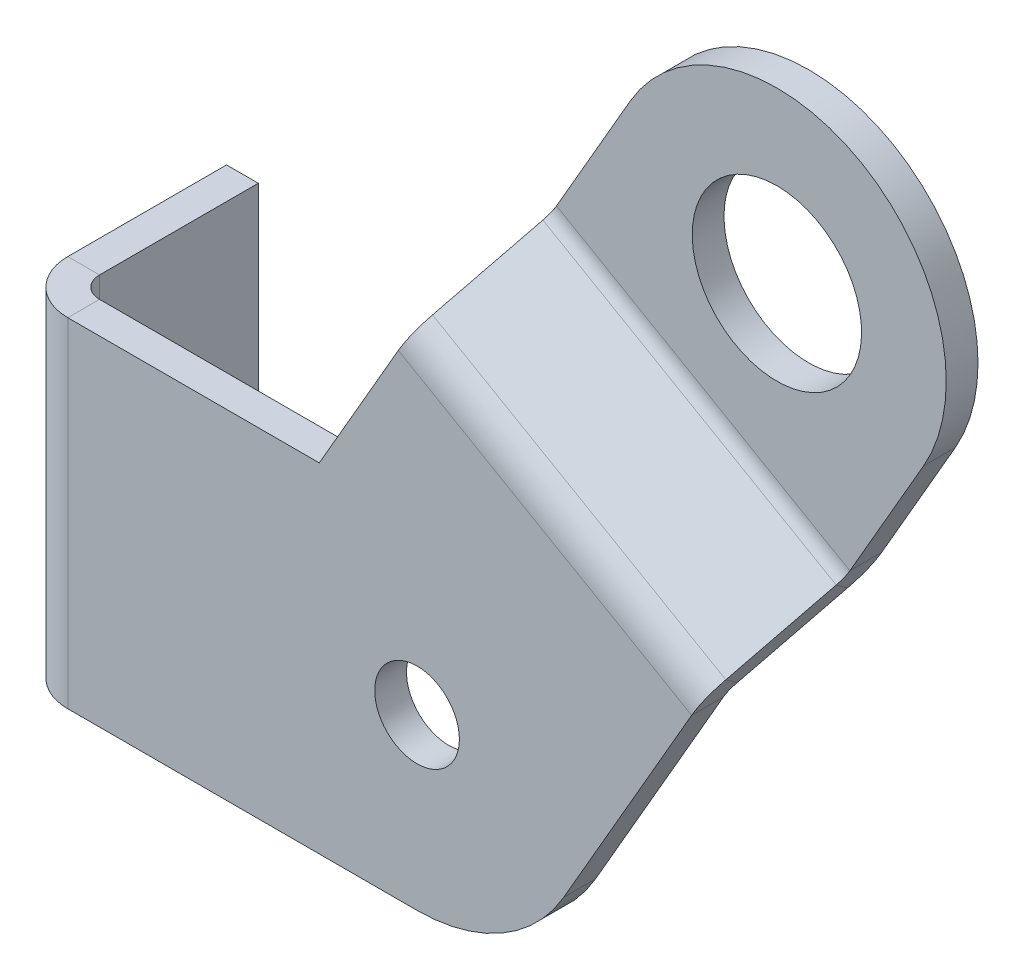
ISO-10303-21;
HEADER;
FILE_DESCRIPTION(('STEP AP214'),'2;1');
FILE_NAME('part.step','',(''),(''),'','','');
FILE_SCHEMA(('AUTOMOTIVE_DESIGN { 1 0 10303 214 1 1 1 1 }'));
ENDSEC;
DATA;
#1=APPLICATION_CONTEXT('core data for automotive mechanical design processes');
#2=APPLICATION_PROTOCOL_DEFINITION('international standard','automotive_design',2000,#1);
#3=PRODUCT_CONTEXT('',#1,'mechanical');
#4=PRODUCT('Part','Part','',(#3));
#5=PRODUCT_RELATED_PRODUCT_CATEGORY('part','',(#4));
#6=PRODUCT_DEFINITION_FORMATION('','',#4);
#7=PRODUCT_DEFINITION_CONTEXT('part definition',#1,'design');
#8=PRODUCT_DEFINITION('design','',#6,#7);
#9=PRODUCT_DEFINITION_SHAPE('','',#8);
#10=(LENGTH_UNIT() NAMED_UNIT(*) SI_UNIT(.MILLI.,.METRE.));
#11=(NAMED_UNIT(*) PLANE_ANGLE_UNIT() SI_UNIT($,.RADIAN.));
#12=(NAMED_UNIT(*) SI_UNIT($,.STERADIAN.) SOLID_ANGLE_UNIT());
#13=UNCERTAINTY_MEASURE_WITH_UNIT(LENGTH_MEASURE(1.E-05),#10,'distance_accuracy_value','');
#14=(GEOMETRIC_REPRESENTATION_CONTEXT(3) GLOBAL_UNCERTAINTY_ASSIGNED_CONTEXT((#13)) GLOBAL_UNIT_ASSIGNED_CONTEXT((#10,
#11,#12)) REPRESENTATION_CONTEXT('',''));
#15=CARTESIAN_POINT('',(0.,0.,0.));
#16=DIRECTION('',(0.,0.,1.));
#17=DIRECTION('',(1.,0.,0.));
#18=AXIS2_PLACEMENT_3D('',#15,#16,#17);
#19=CARTESIAN_POINT('',(-0.735086116991229,30.7267934974324,3.));
#20=DIRECTION('',(0.866025403784436,-0.500000000000004,0.));
#21=DIRECTION('',(-0.353553390593277,-0.612372435695793,0.707106781186547));
#22=AXIS2_PLACEMENT_3D('',#19,#20,#21);
#23=PLANE('',#22);
#24=DIRECTION('',(0.353553390593277,0.612372435695792,0.707106781186548));
#25=VECTOR('',#24,1.);
#26=CARTESIAN_POINT('',(3.47202066419535,38.0137161953151,-5.41421356237309));
#27=LINE('',#26,#25);
#28=CARTESIAN_POINT('',(2.41136049241552,36.1765988882277,-7.53553390593274));
#29=VERTEX_POINT('',#28);
#30=CARTESIAN_POINT('',(3.47202066419535,38.0137161953151,-5.41421356237309));
#31=VERTEX_POINT('',#30);
#32=EDGE_CURVE('E13',#29,#31,#27,.T.);
#33=ORIENTED_EDGE('',*,*,#32,.F.);
#34=DIRECTION('',(-0.353553390593277,-0.612372435695793,0.707106781186547));
#35=VECTOR('',#34,1.);
#36=CARTESIAN_POINT('',(-1.79574628877106,28.889676190345,0.878679656440357));
#37=LINE('',#36,#35);
#38=CARTESIAN_POINT('',(-1.0635132417374,30.1579410307882,-0.585786437626908));
#39=VERTEX_POINT('',#38);
#40=EDGE_CURVE('E206',#29,#39,#37,.T.);
#41=ORIENTED_EDGE('',*,*,#40,.T.);
#42=DIRECTION('',(0.353553390593274,0.612372435695795,0.707106781186547));
#43=VECTOR('',#42,1.);
#44=CARTESIAN_POINT('',(-0.00285306995759065,31.9950583378756,1.53553390593274));
#45=LINE('',#44,#43);
#46=CARTESIAN_POINT('',(-0.00285306995759065,31.9950583378756,1.53553390593274));
#47=VERTEX_POINT('',#46);
#48=EDGE_CURVE('E144',#39,#47,#45,.T.);
#49=ORIENTED_EDGE('',*,*,#48,.T.);
#50=DIRECTION('',(-0.353553390593277,-0.612372435695793,0.707106781186547));
#51=VECTOR('',#50,1.);
#52=CARTESIAN_POINT('',(-0.735086116991229,30.7267934974324,3.));
#53=LINE('',#52,#51);
#54=EDGE_CURVE('E209',#31,#47,#53,.T.);
#55=ORIENTED_EDGE('',*,*,#54,.F.);
#56=EDGE_LOOP('',(#33,#41,#49,#55));
#57=FACE_BOUND('',#56,.T.);
#58=ADVANCED_FACE('F134',(#57),#23,.F.);
#59=CARTESIAN_POINT('',(-1.77062002292397,28.9331961593967,-2.));
#60=DIRECTION('',(0.866025403784437,-0.500000000000004,0.));
#61=DIRECTION('',(0.500000000000004,0.866025403784437,0.));
#62=AXIS2_PLACEMENT_3D('',#59,#60,#61);
#63=PLANE('',#62);
#64=ORIENTED_EDGE('',*,*,#48,.F.);
#65=CARTESIAN_POINT('',(-1.77062002292396,28.9331961593967,-2.));
#66=DIRECTION('',(-0.866025403784436,0.500000000000004,0.));
#67=DIRECTION('',(-0.500000000000004,-0.866025403784436,0.));
#68=AXIS2_PLACEMENT_3D('',#65,#66,#67);
#69=CIRCLE('',#68,2.);
#70=CARTESIAN_POINT('',(-1.77062002292396,28.9331961593967,0.));
#71=VERTEX_POINT('',#70);
#72=EDGE_CURVE('E354',#39,#71,#69,.F.);
#73=ORIENTED_EDGE('',*,*,#72,.T.);
#74=DIRECTION('',(0.,0.,1.));
#75=VECTOR('',#74,1.);
#76=CARTESIAN_POINT('',(-1.77062002292398,28.9331961593967,3.));
#77=LINE('',#76,#75);
#78=CARTESIAN_POINT('',(-1.77062002292398,28.9331961593967,3.));
#79=VERTEX_POINT('',#78);
#80=EDGE_CURVE('E287',#71,#79,#77,.T.);
#81=ORIENTED_EDGE('',*,*,#80,.T.);
#82=CARTESIAN_POINT('',(-1.77062002292397,28.9331961593967,-2.));
#83=DIRECTION('',(-0.866025403784437,0.500000000000004,0.));
#84=DIRECTION('',(-0.500000000000004,-0.866025403784437,0.));
#85=AXIS2_PLACEMENT_3D('',#82,#83,#84);
#86=CIRCLE('',#85,5.);
#87=EDGE_CURVE('E309',#47,#79,#86,.F.);
#88=ORIENTED_EDGE('',*,*,#87,.F.);
#89=EDGE_LOOP('',(#64,#73,#81,#88));
#90=FACE_BOUND('',#89,.T.);
#91=ADVANCED_FACE('F310',(#90),#63,.F.);
#92=CARTESIAN_POINT('',(-13.856406460551,8.00000000000006,3.));
#93=DIRECTION('',(-0.866025403784436,0.500000000000004,0.));
#94=DIRECTION('',(-0.500000000000004,-0.866025403784436,0.));
#95=AXIS2_PLACEMENT_3D('',#92,#93,#94);
#96=PLANE('',#95);
#97=ORIENTED_EDGE('',*,*,#80,.F.);
#98=DIRECTION('',(-0.500000000000004,-0.866025403784436,0.));
#99=VECTOR('',#98,1.);
#100=CARTESIAN_POINT('',(-13.856406460551,8.00000000000006,0.));
#101=LINE('',#100,#99);
#102=CARTESIAN_POINT('',(-9.23760430703396,16.,0.));
#103=VERTEX_POINT('',#102);
#104=EDGE_CURVE('E236',#71,#103,#101,.T.);
#105=ORIENTED_EDGE('',*,*,#104,.T.);
#106=DIRECTION('',(0.,0.,1.));
#107=VECTOR('',#106,1.);
#108=CARTESIAN_POINT('',(-9.23760430703396,16.,3.));
#109=LINE('',#108,#107);
#110=CARTESIAN_POINT('',(-9.23760430703396,16.,3.));
#111=VERTEX_POINT('',#110);
#112=EDGE_CURVE('E284',#103,#111,#109,.T.);
#113=ORIENTED_EDGE('',*,*,#112,.T.);
#114=DIRECTION('',(-0.500000000000004,-0.866025403784436,0.));
#115=VECTOR('',#114,1.);
#116=CARTESIAN_POINT('',(-13.856406460551,8.00000000000006,3.));
#117=LINE('',#116,#115);
#118=EDGE_CURVE('E305',#79,#111,#117,.T.);
#119=ORIENTED_EDGE('',*,*,#118,.F.);
#120=EDGE_LOOP('',(#97,#105,#113,#119));
#121=FACE_BOUND('',#120,.T.);
#122=ADVANCED_FACE('F382',(#121),#96,.T.);
#123=CARTESIAN_POINT('',(0.,16.,3.));
#124=DIRECTION('',(0.,-1.,0.));
#125=DIRECTION('',(1.,0.,0.));
#126=AXIS2_PLACEMENT_3D('',#123,#124,#125);
#127=PLANE('',#126);
#128=ORIENTED_EDGE('',*,*,#112,.F.);
#129=DIRECTION('',(1.,0.,0.));
#130=VECTOR('',#129,1.);
#131=CARTESIAN_POINT('',(0.,16.,0.));
#132=LINE('',#131,#130);
#133=CARTESIAN_POINT('',(-33.,16.,0.));
#134=VERTEX_POINT('',#133);
#135=EDGE_CURVE('E367',#134,#103,#132,.T.);
#136=ORIENTED_EDGE('',*,*,#135,.F.);
#137=DIRECTION('',(0.,0.,1.));
#138=VECTOR('',#137,1.);
#139=CARTESIAN_POINT('',(-33.,16.,3.));
#140=LINE('',#139,#138);
#141=CARTESIAN_POINT('',(-33.,16.,3.));
#142=VERTEX_POINT('',#141);
#143=EDGE_CURVE('E281',#134,#142,#140,.T.);
#144=ORIENTED_EDGE('',*,*,#143,.T.);
#145=DIRECTION('',(1.,0.,0.));
#146=VECTOR('',#145,1.);
#147=CARTESIAN_POINT('',(0.,16.,3.));
#148=LINE('',#147,#146);
#149=EDGE_CURVE('E389',#142,#111,#148,.T.);
#150=ORIENTED_EDGE('',*,*,#149,.T.);
#151=EDGE_LOOP('',(#128,#136,#144,#150));
#152=FACE_BOUND('',#151,.T.);
#153=ADVANCED_FACE('F830',(#152),#127,.F.);
#154=CARTESIAN_POINT('',(0.,-16.,3.));
#155=DIRECTION('',(0.,1.,0.));
#156=DIRECTION('',(-1.,0.,0.));
#157=AXIS2_PLACEMENT_3D('',#154,#155,#156);
#158=PLANE('',#157);
#159=DIRECTION('',(0.,0.,1.));
#160=VECTOR('',#159,1.);
#161=CARTESIAN_POINT('',(-33.,-16.,3.));
#162=LINE('',#161,#160);
#163=CARTESIAN_POINT('',(-33.,-16.,0.));
#164=VERTEX_POINT('',#163);
#165=CARTESIAN_POINT('',(-33.,-16.,3.));
#166=VERTEX_POINT('',#165);
#167=EDGE_CURVE('E278',#164,#166,#162,.T.);
#168=ORIENTED_EDGE('',*,*,#167,.F.);
#169=DIRECTION('',(1.,0.,0.));
#170=VECTOR('',#169,1.);
#171=CARTESIAN_POINT('',(0.,-16.,0.));
#172=LINE('',#171,#170);
#173=CARTESIAN_POINT('',(0.,-16.,0.));
#174=VERTEX_POINT('',#173);
#175=EDGE_CURVE('E362',#174,#164,#172,.F.);
#176=ORIENTED_EDGE('',*,*,#175,.F.);
#177=DIRECTION('',(0.,0.,1.));
#178=VECTOR('',#177,1.);
#179=CARTESIAN_POINT('',(0.,-16.,3.));
#180=LINE('',#179,#178);
#181=CARTESIAN_POINT('',(0.,-16.,3.));
#182=VERTEX_POINT('',#181);
#183=EDGE_CURVE('E275',#174,#182,#180,.T.);
#184=ORIENTED_EDGE('',*,*,#183,.T.);
#185=DIRECTION('',(-1.,0.,0.));
#186=VECTOR('',#185,1.);
#187=CARTESIAN_POINT('',(0.,-16.,3.));
#188=LINE('',#187,#186);
#189=EDGE_CURVE('E429',#182,#166,#188,.T.);
#190=ORIENTED_EDGE('',*,*,#189,.T.);
#191=EDGE_LOOP('',(#168,#176,#184,#190));
#192=FACE_BOUND('',#191,.T.);
#193=ADVANCED_FACE('F836',(#192),#158,.F.);
#194=CARTESIAN_POINT('',(0.,0.,3.));
#195=DIRECTION('',(0.,0.,1.));
#196=DIRECTION('',(1.,0.,0.));
#197=AXIS2_PLACEMENT_3D('',#194,#195,#196);
#198=CYLINDRICAL_SURFACE('',#197,16.);
#199=ORIENTED_EDGE('',*,*,#183,.F.);
#200=CARTESIAN_POINT('',(0.,0.,0.));
#201=DIRECTION('',(0.,0.,1.));
#202=DIRECTION('',(1.,0.,0.));
#203=AXIS2_PLACEMENT_3D('',#200,#201,#202);
#204=CIRCLE('',#203,16.);
#205=CARTESIAN_POINT('',(13.856406460551,-8.00000000000006,0.));
#206=VERTEX_POINT('',#205);
#207=EDGE_CURVE('E359',#174,#206,#204,.T.);
#208=ORIENTED_EDGE('',*,*,#207,.T.);
#209=DIRECTION('',(0.,0.,1.));
#210=VECTOR('',#209,1.);
#211=CARTESIAN_POINT('',(13.856406460551,-8.00000000000006,3.));
#212=LINE('',#211,#210);
#213=CARTESIAN_POINT('',(13.856406460551,-8.00000000000006,3.));
#214=VERTEX_POINT('',#213);
#215=EDGE_CURVE('E272',#206,#214,#212,.T.);
#216=ORIENTED_EDGE('',*,*,#215,.T.);
#217=CARTESIAN_POINT('',(0.,0.,3.));
#218=DIRECTION('',(0.,0.,1.));
#219=DIRECTION('',(1.,0.,0.));
#220=AXIS2_PLACEMENT_3D('',#217,#218,#219);
#221=CIRCLE('',#220,16.);
#222=EDGE_CURVE('E427',#182,#214,#221,.T.);
#223=ORIENTED_EDGE('',*,*,#222,.F.);
#224=EDGE_LOOP('',(#199,#208,#216,#223));
#225=FACE_BOUND('',#224,.T.);
#226=ADVANCED_FACE('F534',(#225),#198,.T.);
#227=CARTESIAN_POINT('',(13.856406460551,-8.00000000000006,3.));
#228=DIRECTION('',(-0.866025403784436,0.500000000000004,0.));
#229=DIRECTION('',(-0.500000000000004,-0.866025403784436,0.));
#230=AXIS2_PLACEMENT_3D('',#227,#228,#229);
#231=PLANE('',#230);
#232=ORIENTED_EDGE('',*,*,#215,.F.);
#233=DIRECTION('',(-0.500000000000004,-0.866025403784436,0.));
#234=VECTOR('',#233,1.);
#235=CARTESIAN_POINT('',(13.856406460551,-8.00000000000006,0.));
#236=LINE('',#235,#234);
#237=CARTESIAN_POINT('',(25.942192898178,12.9331961593965,0.));
#238=VERTEX_POINT('',#237);
#239=EDGE_CURVE('E255',#238,#206,#236,.T.);
#240=ORIENTED_EDGE('',*,*,#239,.F.);
#241=DIRECTION('',(0.,0.,1.));
#242=VECTOR('',#241,1.);
#243=CARTESIAN_POINT('',(25.942192898178,12.9331961593965,3.));
#244=LINE('',#243,#242);
#245=CARTESIAN_POINT('',(25.942192898178,12.9331961593965,3.));
#246=VERTEX_POINT('',#245);
#247=EDGE_CURVE('E269',#238,#246,#244,.T.);
#248=ORIENTED_EDGE('',*,*,#247,.T.);
#249=DIRECTION('',(-0.500000000000004,-0.866025403784436,0.));
#250=VECTOR('',#249,1.);
#251=CARTESIAN_POINT('',(13.856406460551,-8.00000000000006,3.));
#252=LINE('',#251,#250);
#253=EDGE_CURVE('E396',#246,#214,#252,.T.);
#254=ORIENTED_EDGE('',*,*,#253,.T.);
#255=EDGE_LOOP('',(#232,#240,#248,#254));
#256=FACE_BOUND('',#255,.T.);
#257=ADVANCED_FACE('F527',(#256),#231,.F.);
#258=CARTESIAN_POINT('',(25.942192898178,12.9331961593965,-2.));
#259=DIRECTION('',(0.866025403784436,-0.500000000000004,0.));
#260=DIRECTION('',(0.500000000000004,0.866025403784436,0.));
#261=AXIS2_PLACEMENT_3D('',#258,#259,#260);
#262=PLANE('',#261);
#263=ORIENTED_EDGE('',*,*,#247,.F.);
#264=CARTESIAN_POINT('',(25.942192898178,12.9331961593965,-2.));
#265=DIRECTION('',(-0.866025403784436,0.500000000000004,0.));
#266=DIRECTION('',(-0.500000000000004,-0.866025403784436,0.));
#267=AXIS2_PLACEMENT_3D('',#264,#265,#266);
#268=CIRCLE('',#267,2.);
#269=CARTESIAN_POINT('',(26.6492996793645,14.1579410307881,-0.585786437626904));
#270=VERTEX_POINT('',#269);
#271=EDGE_CURVE('E244',#238,#270,#268,.T.);
#272=ORIENTED_EDGE('',*,*,#271,.T.);
#273=DIRECTION('',(0.353553390593277,0.612372435695792,0.707106781186548));
#274=VECTOR('',#273,1.);
#275=CARTESIAN_POINT('',(27.7099598511443,15.9950583378755,1.53553390593274));
#276=LINE('',#275,#274);
#277=CARTESIAN_POINT('',(27.7099598511443,15.9950583378755,1.53553390593274));
#278=VERTEX_POINT('',#277);
#279=EDGE_CURVE('E266',#270,#278,#276,.T.);
#280=ORIENTED_EDGE('',*,*,#279,.T.);
#281=CARTESIAN_POINT('',(25.942192898178,12.9331961593965,-2.));
#282=DIRECTION('',(-0.866025403784436,0.500000000000004,0.));
#283=DIRECTION('',(-0.500000000000004,-0.866025403784436,0.));
#284=AXIS2_PLACEMENT_3D('',#281,#282,#283);
#285=CIRCLE('',#284,5.);
#286=EDGE_CURVE('E314',#246,#278,#285,.T.);
#287=ORIENTED_EDGE('',*,*,#286,.F.);
#288=EDGE_LOOP('',(#263,#272,#280,#287));
#289=FACE_BOUND('',#288,.T.);
#290=ADVANCED_FACE('F525',(#289),#262,.T.);
#291=CARTESIAN_POINT('',(20.4170666323308,3.3633967487161,16.1213203435596));
#292=DIRECTION('',(-0.866025403784436,0.500000000000004,0.));
#293=DIRECTION('',(0.353553390593277,0.612372435695793,-0.707106781186547));
#294=AXIS2_PLACEMENT_3D('',#291,#292,#293);
#295=PLANE('',#294);
#296=ORIENTED_EDGE('',*,*,#279,.F.);
#297=DIRECTION('',(0.353553390593277,0.612372435695793,-0.707106781186547));
#298=VECTOR('',#297,1.);
#299=CARTESIAN_POINT('',(19.356406460551,1.52627944162872,14.));
#300=LINE('',#299,#298);
#301=CARTESIAN_POINT('',(30.1241734135175,20.1765988882275,-7.53553390593273));
#302=VERTEX_POINT('',#301);
#303=EDGE_CURVE('E237',#270,#302,#300,.T.);
#304=ORIENTED_EDGE('',*,*,#303,.T.);
#305=DIRECTION('',(0.353553390593276,0.612372435695795,0.707106781186546));
#306=VECTOR('',#305,1.);
#307=CARTESIAN_POINT('',(31.1848335852973,22.0137161953149,-5.41421356237309));
#308=LINE('',#307,#306);
#309=CARTESIAN_POINT('',(31.1848335852973,22.0137161953149,-5.41421356237309));
#310=VERTEX_POINT('',#309);
#311=EDGE_CURVE('E263',#302,#310,#308,.T.);
#312=ORIENTED_EDGE('',*,*,#311,.T.);
#313=DIRECTION('',(0.353553390593277,0.612372435695793,-0.707106781186547));
#314=VECTOR('',#313,1.);
#315=CARTESIAN_POINT('',(20.4170666323308,3.3633967487161,16.1213203435596));
#316=LINE('',#315,#314);
#317=EDGE_CURVE('E306',#278,#310,#316,.T.);
#318=ORIENTED_EDGE('',*,*,#317,.F.);
#319=EDGE_LOOP('',(#296,#304,#312,#318));
#320=FACE_BOUND('',#319,.T.);
#321=ADVANCED_FACE('F401',(#320),#295,.F.);
#322=CARTESIAN_POINT('',(31.8919403664839,23.2384610667065,-4.));
#323=DIRECTION('',(0.866025403784436,-0.500000000000004,0.));
#324=DIRECTION('',(0.500000000000004,0.866025403784436,0.));
#325=AXIS2_PLACEMENT_3D('',#322,#323,#324);
#326=PLANE('',#325);
#327=ORIENTED_EDGE('',*,*,#311,.F.);
#328=CARTESIAN_POINT('',(31.8919403664838,23.2384610667065,-4.));
#329=DIRECTION('',(0.866025403784436,-0.500000000000004,0.));
#330=DIRECTION('',(0.500000000000004,0.866025403784436,0.));
#331=AXIS2_PLACEMENT_3D('',#328,#329,#330);
#332=CIRCLE('',#331,5.);
#333=CARTESIAN_POINT('',(31.8919403664839,23.2384610667065,-9.));
#334=VERTEX_POINT('',#333);
#335=EDGE_CURVE('E224',#302,#334,#332,.T.);
#336=ORIENTED_EDGE('',*,*,#335,.T.);
#337=DIRECTION('',(0.,0.,1.));
#338=VECTOR('',#337,1.);
#339=CARTESIAN_POINT('',(31.8919403664839,23.2384610667065,-6.));
#340=LINE('',#339,#338);
#341=CARTESIAN_POINT('',(31.8919403664839,23.2384610667065,-6.));
#342=VERTEX_POINT('',#341);
#343=EDGE_CURVE('E152',#334,#342,#340,.T.);
#344=ORIENTED_EDGE('',*,*,#343,.T.);
#345=CARTESIAN_POINT('',(31.8919403664839,23.2384610667065,-4.));
#346=DIRECTION('',(-0.866025403784436,0.500000000000004,0.));
#347=DIRECTION('',(-0.500000000000004,-0.866025403784436,0.));
#348=AXIS2_PLACEMENT_3D('',#345,#346,#347);
#349=CIRCLE('',#348,2.);
#350=EDGE_CURVE('E330',#310,#342,#349,.F.);
#351=ORIENTED_EDGE('',*,*,#350,.F.);
#352=EDGE_LOOP('',(#327,#336,#344,#351));
#353=FACE_BOUND('',#352,.T.);
#354=ADVANCED_FACE('F403',(#353),#326,.T.);
#355=CARTESIAN_POINT('',(13.856406460551,-8.00000000000006,-5.99999999999999));
#356=DIRECTION('',(-0.866025403784436,0.500000000000004,0.));
#357=DIRECTION('',(0.500000000000004,0.866025403784436,0.));
#358=AXIS2_PLACEMENT_3D('',#355,#356,#357);
#359=PLANE('',#358);
#360=ORIENTED_EDGE('',*,*,#343,.F.);
#361=DIRECTION('',(0.500000000000004,0.866025403784436,0.));
#362=VECTOR('',#361,1.);
#363=CARTESIAN_POINT('',(13.856406460551,-8.00000000000006,-8.99999999999999));
#364=LINE('',#363,#362);
#365=CARTESIAN_POINT('',(38.8564064605512,35.3012701892217,-9.));
#366=VERTEX_POINT('',#365);
#367=EDGE_CURVE('E341',#334,#366,#364,.T.);
#368=ORIENTED_EDGE('',*,*,#367,.T.);
#369=DIRECTION('',(0.,0.,1.));
#370=VECTOR('',#369,1.);
#371=CARTESIAN_POINT('',(38.8564064605512,35.3012701892217,-6.));
#372=LINE('',#371,#370);
#373=CARTESIAN_POINT('',(38.8564064605512,35.3012701892217,-6.));
#374=VERTEX_POINT('',#373);
#375=EDGE_CURVE('E259',#366,#374,#372,.T.);
#376=ORIENTED_EDGE('',*,*,#375,.T.);
#377=DIRECTION('',(0.500000000000004,0.866025403784436,0.));
#378=VECTOR('',#377,1.);
#379=CARTESIAN_POINT('',(13.856406460551,-8.00000000000006,-5.99999999999999));
#380=LINE('',#379,#378);
#381=EDGE_CURVE('E321',#342,#374,#380,.T.);
#382=ORIENTED_EDGE('',*,*,#381,.F.);
#383=EDGE_LOOP('',(#360,#368,#376,#382));
#384=FACE_BOUND('',#383,.T.);
#385=ADVANCED_FACE('F568',(#384),#359,.F.);
#386=CARTESIAN_POINT('',(25.0000000000002,43.3012701892218,-6.));
#387=DIRECTION('',(0.,0.,-1.));
#388=DIRECTION('',(0.,1.,0.));
#389=AXIS2_PLACEMENT_3D('',#386,#387,#388);
#390=CYLINDRICAL_SURFACE('',#389,16.);
#391=ORIENTED_EDGE('',*,*,#375,.F.);
#392=CARTESIAN_POINT('',(25.0000000000002,43.3012701892218,-9.));
#393=DIRECTION('',(0.,0.,-1.));
#394=DIRECTION('',(0.,1.,0.));
#395=AXIS2_PLACEMENT_3D('',#392,#393,#394);
#396=CIRCLE('',#395,16.);
#397=CARTESIAN_POINT('',(11.1435935394492,51.3012701892219,-9.));
#398=VERTEX_POINT('',#397);
#399=EDGE_CURVE('E346',#366,#398,#396,.F.);
#400=ORIENTED_EDGE('',*,*,#399,.T.);
#401=DIRECTION('',(0.,0.,1.));
#402=VECTOR('',#401,1.);
#403=CARTESIAN_POINT('',(11.1435935394492,51.3012701892219,-6.));
#404=LINE('',#403,#402);
#405=CARTESIAN_POINT('',(11.1435935394492,51.3012701892219,-6.));
#406=VERTEX_POINT('',#405);
#407=EDGE_CURVE('E256',#398,#406,#404,.T.);
#408=ORIENTED_EDGE('',*,*,#407,.T.);
#409=CARTESIAN_POINT('',(25.0000000000002,43.3012701892218,-6.));
#410=DIRECTION('',(0.,0.,-1.));
#411=DIRECTION('',(0.,1.,0.));
#412=AXIS2_PLACEMENT_3D('',#409,#410,#411);
#413=CIRCLE('',#412,16.);
#414=EDGE_CURVE('E416',#374,#406,#413,.F.);
#415=ORIENTED_EDGE('',*,*,#414,.F.);
#416=EDGE_LOOP('',(#391,#400,#408,#415));
#417=FACE_BOUND('',#416,.T.);
#418=ADVANCED_FACE('F565',(#417),#390,.T.);
#419=CARTESIAN_POINT('',(3.76491388300881,38.5210221314923,-6.));
#420=DIRECTION('',(0.866025403784436,-0.500000000000004,0.));
#421=DIRECTION('',(-0.500000000000004,-0.866025403784436,0.));
#422=AXIS2_PLACEMENT_3D('',#419,#420,#421);
#423=PLANE('',#422);
#424=ORIENTED_EDGE('',*,*,#407,.F.);
#425=DIRECTION('',(-0.500000000000004,-0.866025403784436,0.));
#426=VECTOR('',#425,1.);
#427=CARTESIAN_POINT('',(3.76491388300881,38.5210221314923,-9.));
#428=LINE('',#427,#426);
#429=CARTESIAN_POINT('',(4.1791274453819,39.2384610667066,-9.));
#430=VERTEX_POINT('',#429);
#431=EDGE_CURVE('E347',#398,#430,#428,.T.);
#432=ORIENTED_EDGE('',*,*,#431,.T.);
#433=DIRECTION('',(0.,0.,1.));
#434=VECTOR('',#433,1.);
#435=CARTESIAN_POINT('',(4.17912744538191,39.2384610667066,-6.));
#436=LINE('',#435,#434);
#437=CARTESIAN_POINT('',(4.17912744538191,39.2384610667066,-6.));
#438=VERTEX_POINT('',#437);
#439=EDGE_CURVE('E138',#430,#438,#436,.T.);
#440=ORIENTED_EDGE('',*,*,#439,.T.);
#441=DIRECTION('',(-0.500000000000004,-0.866025403784436,0.));
#442=VECTOR('',#441,1.);
#443=CARTESIAN_POINT('',(3.76491388300881,38.5210221314923,-6.));
#444=LINE('',#443,#442);
#445=EDGE_CURVE('E326',#406,#438,#444,.T.);
#446=ORIENTED_EDGE('',*,*,#445,.F.);
#447=EDGE_LOOP('',(#424,#432,#440,#446));
#448=FACE_BOUND('',#447,.T.);
#449=ADVANCED_FACE('F556',(#448),#423,.F.);
#450=CARTESIAN_POINT('',(0.,0.,3.));
#451=DIRECTION('',(0.,0.,1.));
#452=DIRECTION('',(1.,0.,0.));
#453=AXIS2_PLACEMENT_3D('',#450,#451,#452);
#454=CYLINDRICAL_SURFACE('',#453,4.);
#455=CARTESIAN_POINT('',(0.,0.,3.));
#456=DIRECTION('',(0.,0.,1.));
#457=DIRECTION('',(1.,0.,0.));
#458=AXIS2_PLACEMENT_3D('',#455,#456,#457);
#459=CIRCLE('',#458,4.);
#460=CARTESIAN_POINT('',(4.,0.,3.));
#461=VERTEX_POINT('',#460);
#462=EDGE_CURVE('E423',#461,#461,#459,.T.);
#463=ORIENTED_EDGE('',*,*,#462,.T.);
#464=EDGE_LOOP('',(#463));
#465=FACE_BOUND('',#464,.T.);
#466=CARTESIAN_POINT('',(0.,0.,0.));
#467=DIRECTION('',(0.,0.,1.));
#468=DIRECTION('',(1.,0.,0.));
#469=AXIS2_PLACEMENT_3D('',#466,#467,#468);
#470=CIRCLE('',#469,4.);
#471=CARTESIAN_POINT('',(4.,0.,0.));
#472=VERTEX_POINT('',#471);
#473=EDGE_CURVE('E251',#472,#472,#470,.T.);
#474=ORIENTED_EDGE('',*,*,#473,.F.);
#475=EDGE_LOOP('',(#474));
#476=FACE_BOUND('',#475,.T.);
#477=ADVANCED_FACE('F136',(#465,#476),#454,.F.);
#478=CARTESIAN_POINT('',(25.0000000000002,43.3012701892218,-6.));
#479=DIRECTION('',(0.,0.,-1.));
#480=DIRECTION('',(0.,1.,0.));
#481=AXIS2_PLACEMENT_3D('',#478,#479,#480);
#482=CYLINDRICAL_SURFACE('',#481,7.99999999999999);
#483=CARTESIAN_POINT('',(25.0000000000002,43.3012701892218,-6.));
#484=DIRECTION('',(0.,0.,-1.));
#485=DIRECTION('',(0.,1.,0.));
#486=AXIS2_PLACEMENT_3D('',#483,#484,#485);
#487=CIRCLE('',#486,7.99999999999999);
#488=CARTESIAN_POINT('',(25.0000000000002,51.3012701892218,-6.));
#489=VERTEX_POINT('',#488);
#490=EDGE_CURVE('E418',#489,#489,#487,.T.);
#491=ORIENTED_EDGE('',*,*,#490,.F.);
#492=EDGE_LOOP('',(#491));
#493=FACE_BOUND('',#492,.T.);
#494=CARTESIAN_POINT('',(25.0000000000002,43.3012701892218,-9.));
#495=DIRECTION('',(0.,0.,-1.));
#496=DIRECTION('',(0.,1.,0.));
#497=AXIS2_PLACEMENT_3D('',#494,#495,#496);
#498=CIRCLE('',#497,7.99999999999999);
#499=CARTESIAN_POINT('',(25.0000000000002,51.3012701892218,-9.));
#500=VERTEX_POINT('',#499);
#501=EDGE_CURVE('E254',#500,#500,#498,.T.);
#502=ORIENTED_EDGE('',*,*,#501,.T.);
#503=EDGE_LOOP('',(#502));
#504=FACE_BOUND('',#503,.T.);
#505=ADVANCED_FACE('F544',(#493,#504),#482,.F.);
#506=CARTESIAN_POINT('',(4.17912744538191,39.2384610667066,-4.));
#507=DIRECTION('',(-0.866025403784436,0.500000000000004,0.));
#508=DIRECTION('',(-0.500000000000004,-0.866025403784436,0.));
#509=AXIS2_PLACEMENT_3D('',#506,#507,#508);
#510=PLANE('',#509);
#511=CARTESIAN_POINT('',(4.1791274453819,39.2384610667066,-4.));
#512=DIRECTION('',(0.866025403784436,-0.500000000000004,0.));
#513=DIRECTION('',(0.500000000000004,0.866025403784436,0.));
#514=AXIS2_PLACEMENT_3D('',#511,#512,#513);
#515=CIRCLE('',#514,5.);
#516=EDGE_CURVE('E222',#430,#29,#515,.F.);
#517=ORIENTED_EDGE('',*,*,#516,.T.);
#518=ORIENTED_EDGE('',*,*,#32,.T.);
#519=CARTESIAN_POINT('',(4.17912744538191,39.2384610667066,-4.));
#520=DIRECTION('',(0.866025403784436,-0.500000000000004,0.));
#521=DIRECTION('',(0.500000000000004,0.866025403784436,0.));
#522=AXIS2_PLACEMENT_3D('',#519,#520,#521);
#523=CIRCLE('',#522,2.);
#524=EDGE_CURVE('E336',#438,#31,#523,.F.);
#525=ORIENTED_EDGE('',*,*,#524,.F.);
#526=ORIENTED_EDGE('',*,*,#439,.F.);
#527=EDGE_LOOP('',(#517,#518,#525,#526));
#528=FACE_BOUND('',#527,.T.);
#529=ADVANCED_FACE('F240',(#528),#510,.T.);
#530=CARTESIAN_POINT('',(55.2995235738353,8.76750135391102,-6.));
#531=DIRECTION('',(0.,0.,-1.));
#532=DIRECTION('',(0.,1.,0.));
#533=AXIS2_PLACEMENT_3D('',#530,#531,#532);
#534=PLANE('',#533);
#535=ORIENTED_EDGE('',*,*,#490,.T.);
#536=EDGE_LOOP('',(#535));
#537=FACE_BOUND('',#536,.T.);
#538=ORIENTED_EDGE('',*,*,#445,.T.);
#539=DIRECTION('',(-0.866025403784436,0.500000000000004,0.));
#540=VECTOR('',#539,1.);
#541=CARTESIAN_POINT('',(31.8919403664839,23.2384610667065,-6.));
#542=LINE('',#541,#540);
#543=EDGE_CURVE('E333',#438,#342,#542,.F.);
#544=ORIENTED_EDGE('',*,*,#543,.T.);
#545=ORIENTED_EDGE('',*,*,#381,.T.);
#546=ORIENTED_EDGE('',*,*,#414,.T.);
#547=EDGE_LOOP('',(#538,#544,#545,#546));
#548=FACE_BOUND('',#547,.T.);
#549=ADVANCED_FACE('F410',(#537,#548),#534,.F.);
#550=CARTESIAN_POINT('',(0.,0.,3.));
#551=DIRECTION('',(0.,0.,1.));
#552=DIRECTION('',(1.,0.,0.));
#553=AXIS2_PLACEMENT_3D('',#550,#551,#552);
#554=PLANE('',#553);
#555=ORIENTED_EDGE('',*,*,#253,.F.);
#556=DIRECTION('',(0.866025403784436,-0.500000000000004,0.));
#557=VECTOR('',#556,1.);
#558=CARTESIAN_POINT('',(-1.77062002292396,28.9331961593967,3.));
#559=LINE('',#558,#557);
#560=EDGE_CURVE('E320',#246,#79,#559,.F.);
#561=ORIENTED_EDGE('',*,*,#560,.T.);
#562=ORIENTED_EDGE('',*,*,#118,.T.);
#563=ORIENTED_EDGE('',*,*,#149,.F.);
#564=DIRECTION('',(0.,1.,0.));
#565=VECTOR('',#564,1.);
#566=CARTESIAN_POINT('',(-33.,16.,3.));
#567=LINE('',#566,#565);
#568=EDGE_CURVE('E432',#166,#142,#567,.T.);
#569=ORIENTED_EDGE('',*,*,#568,.F.);
#570=ORIENTED_EDGE('',*,*,#189,.F.);
#571=ORIENTED_EDGE('',*,*,#222,.T.);
#572=EDGE_LOOP('',(#555,#561,#562,#563,#569,#570,#571));
#573=FACE_BOUND('',#572,.T.);
#574=ORIENTED_EDGE('',*,*,#462,.F.);
#575=EDGE_LOOP('',(#574));
#576=FACE_BOUND('',#575,.T.);
#577=ADVANCED_FACE('F392',(#573,#576),#554,.T.);
#578=CARTESIAN_POINT('',(50.7995235738353,0.973272719851093,3.));
#579=DIRECTION('',(-0.353553390593277,-0.612372435695792,-0.707106781186548));
#580=DIRECTION('',(0.,0.755928946018456,-0.654653670707976));
#581=AXIS2_PLACEMENT_3D('',#578,#579,#580);
#582=PLANE('',#581);
#583=ORIENTED_EDGE('',*,*,#317,.T.);
#584=DIRECTION('',(-0.866025403784436,0.500000000000004,0.));
#585=VECTOR('',#584,1.);
#586=CARTESIAN_POINT('',(3.47202066419535,38.0137161953151,-5.41421356237309));
#587=LINE('',#586,#585);
#588=EDGE_CURVE('E304',#310,#31,#587,.T.);
#589=ORIENTED_EDGE('',*,*,#588,.T.);
#590=ORIENTED_EDGE('',*,*,#54,.T.);
#591=DIRECTION('',(0.866025403784436,-0.500000000000004,0.));
#592=VECTOR('',#591,1.);
#593=CARTESIAN_POINT('',(27.7099598511444,15.9950583378755,1.53553390593274));
#594=LINE('',#593,#592);
#595=EDGE_CURVE('E302',#47,#278,#594,.T.);
#596=ORIENTED_EDGE('',*,*,#595,.T.);
#597=EDGE_LOOP('',(#583,#589,#590,#596));
#598=FACE_BOUND('',#597,.T.);
#599=ADVANCED_FACE('F300',(#598),#582,.F.);
#600=CARTESIAN_POINT('',(49.7639896679025,-0.820324618184652,-2.));
#601=DIRECTION('',(-0.866025403784436,0.500000000000004,0.));
#602=DIRECTION('',(-0.500000000000004,-0.866025403784436,0.));
#603=AXIS2_PLACEMENT_3D('',#600,#601,#602);
#604=CYLINDRICAL_SURFACE('',#603,5.);
#605=ORIENTED_EDGE('',*,*,#87,.T.);
#606=ORIENTED_EDGE('',*,*,#560,.F.);
#607=ORIENTED_EDGE('',*,*,#286,.T.);
#608=ORIENTED_EDGE('',*,*,#595,.F.);
#609=EDGE_LOOP('',(#605,#606,#607,#608));
#610=FACE_BOUND('',#609,.T.);
#611=ADVANCED_FACE('F317',(#610),#604,.T.);
#612=CARTESIAN_POINT('',(55.7137371362084,9.48494028912532,-4.));
#613=DIRECTION('',(0.866025403784436,-0.500000000000004,0.));
#614=DIRECTION('',(0.500000000000004,0.866025403784436,0.));
#615=AXIS2_PLACEMENT_3D('',#612,#613,#614);
#616=CYLINDRICAL_SURFACE('',#615,2.);
#617=ORIENTED_EDGE('',*,*,#350,.T.);
#618=ORIENTED_EDGE('',*,*,#543,.F.);
#619=ORIENTED_EDGE('',*,*,#524,.T.);
#620=ORIENTED_EDGE('',*,*,#588,.F.);
#621=EDGE_LOOP('',(#617,#618,#619,#620));
#622=FACE_BOUND('',#621,.T.);
#623=ADVANCED_FACE('F407',(#622),#616,.F.);
#624=CARTESIAN_POINT('',(55.2995235738353,8.76750135391102,-9.));
#625=DIRECTION('',(0.,0.,-1.));
#626=DIRECTION('',(0.,1.,0.));
#627=AXIS2_PLACEMENT_3D('',#624,#625,#626);
#628=PLANE('',#627);
#629=ORIENTED_EDGE('',*,*,#501,.F.);
#630=EDGE_LOOP('',(#629));
#631=FACE_BOUND('',#630,.T.);
#632=ORIENTED_EDGE('',*,*,#431,.F.);
#633=ORIENTED_EDGE('',*,*,#399,.F.);
#634=ORIENTED_EDGE('',*,*,#367,.F.);
#635=DIRECTION('',(0.866025403784436,-0.500000000000004,0.));
#636=VECTOR('',#635,1.);
#637=CARTESIAN_POINT('',(55.7137371362084,9.48494028912533,-9.));
#638=LINE('',#637,#636);
#639=EDGE_CURVE('E228',#430,#334,#638,.T.);
#640=ORIENTED_EDGE('',*,*,#639,.F.);
#641=EDGE_LOOP('',(#632,#633,#634,#640));
#642=FACE_BOUND('',#641,.T.);
#643=ADVANCED_FACE('F659',(#631,#642),#628,.T.);
#644=CARTESIAN_POINT('',(0.,0.,0.));
#645=DIRECTION('',(0.,0.,1.));
#646=DIRECTION('',(1.,0.,0.));
#647=AXIS2_PLACEMENT_3D('',#644,#645,#646);
#648=PLANE('',#647);
#649=ORIENTED_EDGE('',*,*,#239,.T.);
#650=ORIENTED_EDGE('',*,*,#207,.F.);
#651=ORIENTED_EDGE('',*,*,#175,.T.);
#652=DIRECTION('',(0.,1.,0.));
#653=VECTOR('',#652,1.);
#654=CARTESIAN_POINT('',(-33.,0.,0.));
#655=LINE('',#654,#653);
#656=EDGE_CURVE('E365',#164,#134,#655,.T.);
#657=ORIENTED_EDGE('',*,*,#656,.T.);
#658=ORIENTED_EDGE('',*,*,#135,.T.);
#659=ORIENTED_EDGE('',*,*,#104,.F.);
#660=DIRECTION('',(-0.866025403784436,0.500000000000004,0.));
#661=VECTOR('',#660,1.);
#662=CARTESIAN_POINT('',(49.7639896679025,-0.820324618184651,0.));
#663=LINE('',#662,#661);
#664=EDGE_CURVE('E229',#238,#71,#663,.T.);
#665=ORIENTED_EDGE('',*,*,#664,.F.);
#666=EDGE_LOOP('',(#649,#650,#651,#657,#658,#659,#665));
#667=FACE_BOUND('',#666,.T.);
#668=ORIENTED_EDGE('',*,*,#473,.T.);
#669=EDGE_LOOP('',(#668));
#670=FACE_BOUND('',#669,.T.);
#671=ADVANCED_FACE('F378',(#667,#670),#648,.F.);
#672=CARTESIAN_POINT('',(49.7388634020554,-0.863844587236285,0.878679656440357));
#673=DIRECTION('',(-0.353553390593277,-0.612372435695792,-0.707106781186548));
#674=DIRECTION('',(0.,0.755928946018456,-0.654653670707976));
#675=AXIS2_PLACEMENT_3D('',#672,#673,#674);
#676=PLANE('',#675);
#677=ORIENTED_EDGE('',*,*,#303,.F.);
#678=DIRECTION('',(-0.866025403784436,0.500000000000004,0.));
#679=VECTOR('',#678,1.);
#680=CARTESIAN_POINT('',(50.4710964490891,0.404420253206934,-0.585786437626905));
#681=LINE('',#680,#679);
#682=EDGE_CURVE('E234',#39,#270,#681,.F.);
#683=ORIENTED_EDGE('',*,*,#682,.F.);
#684=ORIENTED_EDGE('',*,*,#40,.F.);
#685=DIRECTION('',(0.866025403784436,-0.500000000000004,0.));
#686=VECTOR('',#685,1.);
#687=CARTESIAN_POINT('',(53.945970183242,6.42307811064636,-7.53553390593274));
#688=LINE('',#687,#686);
#689=EDGE_CURVE('E219',#302,#29,#688,.F.);
#690=ORIENTED_EDGE('',*,*,#689,.F.);
#691=EDGE_LOOP('',(#677,#683,#684,#690));
#692=FACE_BOUND('',#691,.T.);
#693=ADVANCED_FACE('F232',(#692),#676,.T.);
#694=CARTESIAN_POINT('',(49.7639896679025,-0.820324618184652,-2.));
#695=DIRECTION('',(-0.866025403784436,0.500000000000004,0.));
#696=DIRECTION('',(-0.500000000000004,-0.866025403784436,0.));
#697=AXIS2_PLACEMENT_3D('',#694,#695,#696);
#698=CYLINDRICAL_SURFACE('',#697,2.);
#699=ORIENTED_EDGE('',*,*,#72,.F.);
#700=ORIENTED_EDGE('',*,*,#682,.T.);
#701=ORIENTED_EDGE('',*,*,#271,.F.);
#702=ORIENTED_EDGE('',*,*,#664,.T.);
#703=EDGE_LOOP('',(#699,#700,#701,#702));
#704=FACE_BOUND('',#703,.T.);
#705=ADVANCED_FACE('F372',(#704),#698,.F.);
#706=CARTESIAN_POINT('',(55.7137371362084,9.48494028912532,-4.));
#707=DIRECTION('',(0.866025403784436,-0.500000000000004,0.));
#708=DIRECTION('',(0.500000000000004,0.866025403784436,0.));
#709=AXIS2_PLACEMENT_3D('',#706,#707,#708);
#710=CYLINDRICAL_SURFACE('',#709,5.);
#711=ORIENTED_EDGE('',*,*,#335,.F.);
#712=ORIENTED_EDGE('',*,*,#689,.T.);
#713=ORIENTED_EDGE('',*,*,#516,.F.);
#714=ORIENTED_EDGE('',*,*,#639,.T.);
#715=EDGE_LOOP('',(#711,#712,#713,#714));
#716=FACE_BOUND('',#715,.T.);
#717=ADVANCED_FACE('F220',(#716),#710,.T.);
#718=CARTESIAN_POINT('',(-33.,-16.,-2.));
#719=DIRECTION('',(0.,-1.,0.));
#720=DIRECTION('',(0.,0.,-1.));
#721=AXIS2_PLACEMENT_3D('',#718,#719,#720);
#722=PLANE('',#721);
#723=DIRECTION('',(1.,0.,0.));
#724=VECTOR('',#723,1.);
#725=CARTESIAN_POINT('',(-38.,-16.,-1.99999999999998));
#726=LINE('',#725,#724);
#727=CARTESIAN_POINT('',(-35.,-16.,-1.99999999999999));
#728=VERTEX_POINT('',#727);
#729=CARTESIAN_POINT('',(-38.,-16.,-1.99999999999998));
#730=VERTEX_POINT('',#729);
#731=EDGE_CURVE('E445',#728,#730,#726,.F.);
#732=ORIENTED_EDGE('',*,*,#731,.F.);
#733=CARTESIAN_POINT('',(-33.,-16.,-2.));
#734=DIRECTION('',(0.,1.,0.));
#735=DIRECTION('',(0.,0.,1.));
#736=AXIS2_PLACEMENT_3D('',#733,#734,#735);
#737=CIRCLE('',#736,2.);
#738=EDGE_CURVE('E439',#164,#728,#737,.F.);
#739=ORIENTED_EDGE('',*,*,#738,.F.);
#740=ORIENTED_EDGE('',*,*,#167,.T.);
#741=CARTESIAN_POINT('',(-33.,-16.,-2.));
#742=DIRECTION('',(0.,1.,0.));
#743=DIRECTION('',(0.,0.,1.));
#744=AXIS2_PLACEMENT_3D('',#741,#742,#743);
#745=CIRCLE('',#744,5.);
#746=EDGE_CURVE('E242',#166,#730,#745,.F.);
#747=ORIENTED_EDGE('',*,*,#746,.T.);
#748=EDGE_LOOP('',(#732,#739,#740,#747));
#749=FACE_BOUND('',#748,.T.);
#750=ADVANCED_FACE('F705',(#749),#722,.T.);
#751=CARTESIAN_POINT('',(-33.,16.,-2.));
#752=DIRECTION('',(0.,-1.,0.));
#753=DIRECTION('',(0.,0.,-1.));
#754=AXIS2_PLACEMENT_3D('',#751,#752,#753);
#755=PLANE('',#754);
#756=CARTESIAN_POINT('',(-33.,16.,-2.));
#757=DIRECTION('',(0.,1.,0.));
#758=DIRECTION('',(0.,0.,1.));
#759=AXIS2_PLACEMENT_3D('',#756,#757,#758);
#760=CIRCLE('',#759,2.);
#761=CARTESIAN_POINT('',(-35.,16.,-1.99999999999999));
#762=VERTEX_POINT('',#761);
#763=EDGE_CURVE('E436',#762,#134,#760,.T.);
#764=ORIENTED_EDGE('',*,*,#763,.F.);
#765=DIRECTION('',(1.,0.,0.));
#766=VECTOR('',#765,1.);
#767=CARTESIAN_POINT('',(-35.,16.,-1.99999999999999));
#768=LINE('',#767,#766);
#769=CARTESIAN_POINT('',(-38.,16.,-1.99999999999998));
#770=VERTEX_POINT('',#769);
#771=EDGE_CURVE('E451',#762,#770,#768,.F.);
#772=ORIENTED_EDGE('',*,*,#771,.T.);
#773=CARTESIAN_POINT('',(-33.,16.,-2.));
#774=DIRECTION('',(0.,1.,0.));
#775=DIRECTION('',(0.,0.,1.));
#776=AXIS2_PLACEMENT_3D('',#773,#774,#775);
#777=CIRCLE('',#776,5.);
#778=EDGE_CURVE('E247',#770,#142,#777,.T.);
#779=ORIENTED_EDGE('',*,*,#778,.T.);
#780=ORIENTED_EDGE('',*,*,#143,.F.);
#781=EDGE_LOOP('',(#764,#772,#779,#780));
#782=FACE_BOUND('',#781,.T.);
#783=ADVANCED_FACE('F714',(#782),#755,.F.);
#784=CARTESIAN_POINT('',(-33.,16.,-2.));
#785=DIRECTION('',(0.,1.,0.));
#786=DIRECTION('',(-1.,0.,0.));
#787=AXIS2_PLACEMENT_3D('',#784,#785,#786);
#788=CYLINDRICAL_SURFACE('',#787,5.);
#789=ORIENTED_EDGE('',*,*,#568,.T.);
#790=ORIENTED_EDGE('',*,*,#778,.F.);
#791=DIRECTION('',(0.,1.,0.));
#792=VECTOR('',#791,1.);
#793=CARTESIAN_POINT('',(-38.,-16.,-1.99999999999998));
#794=LINE('',#793,#792);
#795=EDGE_CURVE('E454',#770,#730,#794,.F.);
#796=ORIENTED_EDGE('',*,*,#795,.T.);
#797=ORIENTED_EDGE('',*,*,#746,.F.);
#798=EDGE_LOOP('',(#789,#790,#796,#797));
#799=FACE_BOUND('',#798,.T.);
#800=ADVANCED_FACE('F724',(#799),#788,.T.);
#801=CARTESIAN_POINT('',(-33.,16.,-2.));
#802=DIRECTION('',(0.,1.,0.));
#803=DIRECTION('',(-1.,0.,0.));
#804=AXIS2_PLACEMENT_3D('',#801,#802,#803);
#805=CYLINDRICAL_SURFACE('',#804,2.);
#806=ORIENTED_EDGE('',*,*,#656,.F.);
#807=ORIENTED_EDGE('',*,*,#738,.T.);
#808=DIRECTION('',(0.,1.,0.));
#809=VECTOR('',#808,1.);
#810=CARTESIAN_POINT('',(-35.,-16.,-1.99999999999999));
#811=LINE('',#810,#809);
#812=EDGE_CURVE('E448',#728,#762,#811,.T.);
#813=ORIENTED_EDGE('',*,*,#812,.T.);
#814=ORIENTED_EDGE('',*,*,#763,.T.);
#815=EDGE_LOOP('',(#806,#807,#813,#814));
#816=FACE_BOUND('',#815,.T.);
#817=ADVANCED_FACE('F735',(#816),#805,.F.);
#818=CARTESIAN_POINT('',(-38.,-16.,0.));
#819=DIRECTION('',(0.,1.,0.));
#820=DIRECTION('',(0.,0.,1.));
#821=AXIS2_PLACEMENT_3D('',#818,#819,#820);
#822=PLANE('',#821);
#823=ORIENTED_EDGE('',*,*,#731,.T.);
#824=DIRECTION('',(0.,0.,1.));
#825=VECTOR('',#824,1.);
#826=CARTESIAN_POINT('',(-38.,-16.,1.31701002220085E-13));
#827=LINE('',#826,#825);
#828=CARTESIAN_POINT('',(-38.0000000000001,-16.,-17.));
#829=VERTEX_POINT('',#828);
#830=EDGE_CURVE('E466',#829,#730,#827,.T.);
#831=ORIENTED_EDGE('',*,*,#830,.F.);
#832=DIRECTION('',(1.,0.,0.));
#833=VECTOR('',#832,1.);
#834=CARTESIAN_POINT('',(-38.0000000000001,-16.,-17.));
#835=LINE('',#834,#833);
#836=CARTESIAN_POINT('',(-35.0000000000001,-16.,-17.));
#837=VERTEX_POINT('',#836);
#838=EDGE_CURVE('E475',#829,#837,#835,.T.);
#839=ORIENTED_EDGE('',*,*,#838,.T.);
#840=DIRECTION('',(0.,0.,-1.));
#841=VECTOR('',#840,1.);
#842=CARTESIAN_POINT('',(-35.,-16.,0.));
#843=LINE('',#842,#841);
#844=EDGE_CURVE('E457',#837,#728,#843,.F.);
#845=ORIENTED_EDGE('',*,*,#844,.T.);
#846=EDGE_LOOP('',(#823,#831,#839,#845));
#847=FACE_BOUND('',#846,.T.);
#848=ADVANCED_FACE('F501',(#847),#822,.F.);
#849=CARTESIAN_POINT('',(-38.0000000000001,16.,-17.));
#850=DIRECTION('',(0.,-1.,0.));
#851=DIRECTION('',(0.,0.,-1.));
#852=AXIS2_PLACEMENT_3D('',#849,#850,#851);
#853=PLANE('',#852);
#854=ORIENTED_EDGE('',*,*,#771,.F.);
#855=DIRECTION('',(0.,0.,1.));
#856=VECTOR('',#855,1.);
#857=CARTESIAN_POINT('',(-35.0000000000001,16.,-17.));
#858=LINE('',#857,#856);
#859=CARTESIAN_POINT('',(-35.0000000000001,16.,-17.));
#860=VERTEX_POINT('',#859);
#861=EDGE_CURVE('E460',#762,#860,#858,.F.);
#862=ORIENTED_EDGE('',*,*,#861,.T.);
#863=DIRECTION('',(1.,0.,0.));
#864=VECTOR('',#863,1.);
#865=CARTESIAN_POINT('',(-38.0000000000001,16.,-17.));
#866=LINE('',#865,#864);
#867=CARTESIAN_POINT('',(-38.0000000000001,16.,-17.));
#868=VERTEX_POINT('',#867);
#869=EDGE_CURVE('E440',#868,#860,#866,.T.);
#870=ORIENTED_EDGE('',*,*,#869,.F.);
#871=DIRECTION('',(0.,0.,-1.));
#872=VECTOR('',#871,1.);
#873=CARTESIAN_POINT('',(-38.,16.,1.31701002220085E-13));
#874=LINE('',#873,#872);
#875=EDGE_CURVE('E469',#770,#868,#874,.T.);
#876=ORIENTED_EDGE('',*,*,#875,.F.);
#877=EDGE_LOOP('',(#854,#862,#870,#876));
#878=FACE_BOUND('',#877,.T.);
#879=ADVANCED_FACE('F756',(#878),#853,.F.);
#880=CARTESIAN_POINT('',(-38.,0.,1.31701002220085E-13));
#881=DIRECTION('',(1.,0.,0.));
#882=DIRECTION('',(0.,0.,-1.));
#883=AXIS2_PLACEMENT_3D('',#880,#881,#882);
#884=PLANE('',#883);
#885=ORIENTED_EDGE('',*,*,#795,.F.);
#886=ORIENTED_EDGE('',*,*,#875,.T.);
#887=DIRECTION('',(0.,-1.,0.));
#888=VECTOR('',#887,1.);
#889=CARTESIAN_POINT('',(-38.0000000000001,0.,-17.));
#890=LINE('',#889,#888);
#891=EDGE_CURVE('E472',#868,#829,#890,.T.);
#892=ORIENTED_EDGE('',*,*,#891,.T.);
#893=ORIENTED_EDGE('',*,*,#830,.T.);
#894=EDGE_LOOP('',(#885,#886,#892,#893));
#895=FACE_BOUND('',#894,.T.);
#896=ADVANCED_FACE('F766',(#895),#884,.F.);
#897=CARTESIAN_POINT('',(-35.,0.,1.21226558203556E-13));
#898=DIRECTION('',(1.,0.,0.));
#899=DIRECTION('',(0.,0.,-1.));
#900=AXIS2_PLACEMENT_3D('',#897,#898,#899);
#901=PLANE('',#900);
#902=ORIENTED_EDGE('',*,*,#861,.F.);
#903=ORIENTED_EDGE('',*,*,#812,.F.);
#904=ORIENTED_EDGE('',*,*,#844,.F.);
#905=DIRECTION('',(0.,1.,0.));
#906=VECTOR('',#905,1.);
#907=CARTESIAN_POINT('',(-35.0000000000001,-16.,-17.));
#908=LINE('',#907,#906);
#909=EDGE_CURVE('E463',#860,#837,#908,.F.);
#910=ORIENTED_EDGE('',*,*,#909,.F.);
#911=EDGE_LOOP('',(#902,#903,#904,#910));
#912=FACE_BOUND('',#911,.T.);
#913=ADVANCED_FACE('F495',(#912),#901,.T.);
#914=CARTESIAN_POINT('',(-38.0000000000001,-16.,-17.));
#915=DIRECTION('',(0.,0.,1.));
#916=DIRECTION('',(1.,0.,0.));
#917=AXIS2_PLACEMENT_3D('',#914,#915,#916);
#918=PLANE('',#917);
#919=ORIENTED_EDGE('',*,*,#909,.T.);
#920=ORIENTED_EDGE('',*,*,#838,.F.);
#921=ORIENTED_EDGE('',*,*,#891,.F.);
#922=ORIENTED_EDGE('',*,*,#869,.T.);
#923=EDGE_LOOP('',(#919,#920,#921,#922));
#924=FACE_BOUND('',#923,.T.);
#925=ADVANCED_FACE('F484',(#924),#918,.F.);
#926=CLOSED_SHELL('',(#58,#91,#122,#153,#193,#226,#257,#290,#321,#354,#385,#418,#449,#477,#505,
#529,#549,#577,#599,#611,#623,#643,#671,#693,#705,#717,#750,#783,#800,#817,#848,#879,#896,#913,#925));
#927=MANIFOLD_SOLID_BREP('B2',#926);
#928=ADVANCED_BREP_SHAPE_REPRESENTATION('',(#18,#927),#14);
#929=SHAPE_DEFINITION_REPRESENTATION(#9,#928);
ENDSEC;
END-ISO-10303-21;
